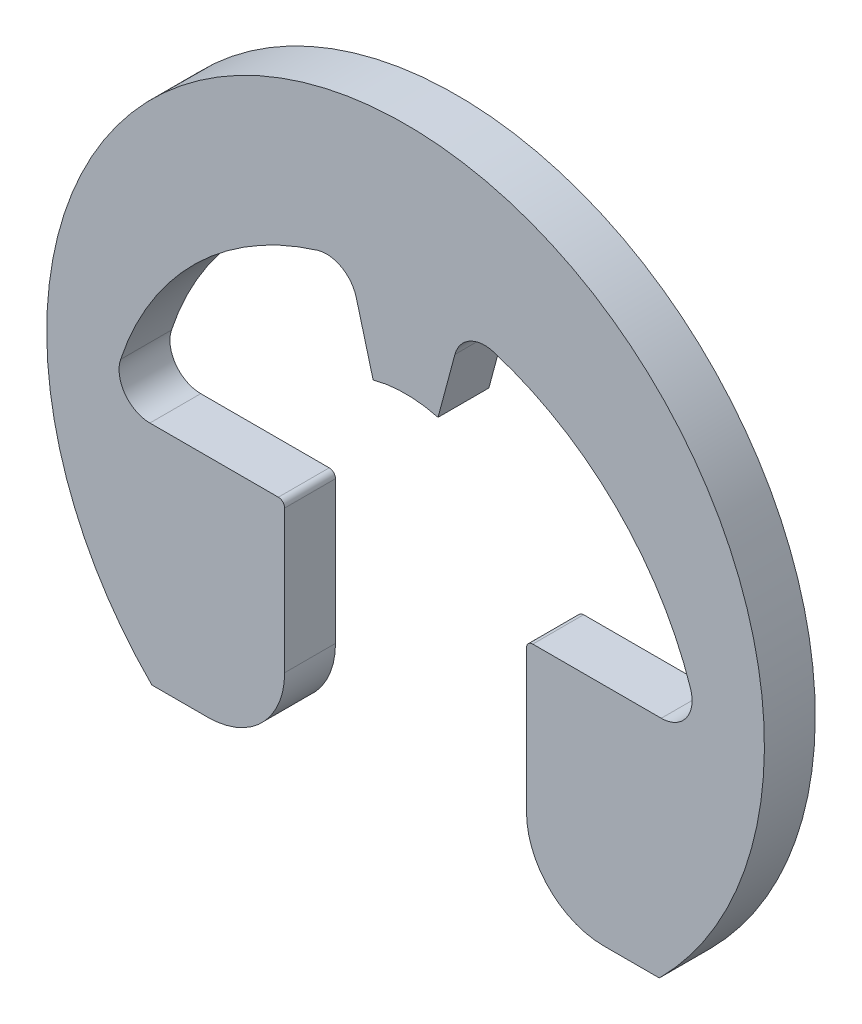
ISO-10303-21;
HEADER;
FILE_DESCRIPTION(('STEP AP214'),'2;1');
FILE_NAME('part.step','',(''),(''),'','','');
FILE_SCHEMA(('AUTOMOTIVE_DESIGN { 1 0 10303 214 1 1 1 1 }'));
ENDSEC;
DATA;
#1=APPLICATION_CONTEXT('core data for automotive mechanical design processes');
#2=APPLICATION_PROTOCOL_DEFINITION('international standard','automotive_design',2000,#1);
#3=PRODUCT_CONTEXT('',#1,'mechanical');
#4=PRODUCT('Part','Part','',(#3));
#5=PRODUCT_RELATED_PRODUCT_CATEGORY('part','',(#4));
#6=PRODUCT_DEFINITION_FORMATION('','',#4);
#7=PRODUCT_DEFINITION_CONTEXT('part definition',#1,'design');
#8=PRODUCT_DEFINITION('design','',#6,#7);
#9=PRODUCT_DEFINITION_SHAPE('','',#8);
#10=(LENGTH_UNIT() NAMED_UNIT(*) SI_UNIT(.MILLI.,.METRE.));
#11=(NAMED_UNIT(*) PLANE_ANGLE_UNIT() SI_UNIT($,.RADIAN.));
#12=(NAMED_UNIT(*) SI_UNIT($,.STERADIAN.) SOLID_ANGLE_UNIT());
#13=UNCERTAINTY_MEASURE_WITH_UNIT(LENGTH_MEASURE(1.E-05),#10,'distance_accuracy_value','');
#14=(GEOMETRIC_REPRESENTATION_CONTEXT(3) GLOBAL_UNCERTAINTY_ASSIGNED_CONTEXT((#13)) GLOBAL_UNIT_ASSIGNED_CONTEXT((#10,
#11,#12)) REPRESENTATION_CONTEXT('',''));
#15=CARTESIAN_POINT('',(0.,0.,0.));
#16=DIRECTION('',(0.,0.,1.));
#17=DIRECTION('',(1.,0.,0.));
#18=AXIS2_PLACEMENT_3D('',#15,#16,#17);
#19=CARTESIAN_POINT('',(-1.91596283078348,0.0224674878166162,-0.381));
#20=DIRECTION('',(0.,0.,1.));
#21=DIRECTION('',(1.,0.,0.));
#22=AXIS2_PLACEMENT_3D('',#19,#20,#21);
#23=CYLINDRICAL_SURFACE('',#22,0.230877533333333);
#24=CARTESIAN_POINT('',(-1.91596283078348,0.0224674878166162,0.));
#25=DIRECTION('',(0.,0.,-1.));
#26=DIRECTION('',(1.,0.,0.));
#27=AXIS2_PLACEMENT_3D('',#24,#25,#26);
#28=CIRCLE('',#27,0.230877533333333);
#29=CARTESIAN_POINT('',(-1.91596283078348,-0.208410045516717,0.));
#30=VERTEX_POINT('',#29);
#31=CARTESIAN_POINT('',(-2.13524840517973,0.0947050975486041,0.));
#32=VERTEX_POINT('',#31);
#33=EDGE_CURVE('E201',#30,#32,#28,.T.);
#34=ORIENTED_EDGE('',*,*,#33,.F.);
#35=DIRECTION('',(0.,0.,1.));
#36=VECTOR('',#35,1.);
#37=CARTESIAN_POINT('',(-1.91596283078348,-0.208410045516717,-0.381));
#38=LINE('',#37,#36);
#39=CARTESIAN_POINT('',(-1.91596283078348,-0.208410045516717,-0.381));
#40=VERTEX_POINT('',#39);
#41=EDGE_CURVE('E11',#40,#30,#38,.T.);
#42=ORIENTED_EDGE('',*,*,#41,.F.);
#43=CARTESIAN_POINT('',(-1.91596283078348,0.0224674878166162,-0.381));
#44=DIRECTION('',(0.,0.,-1.));
#45=DIRECTION('',(1.,0.,0.));
#46=AXIS2_PLACEMENT_3D('',#43,#44,#45);
#47=CIRCLE('',#46,0.230877533333333);
#48=CARTESIAN_POINT('',(-2.13524840517973,0.0947050975486041,-0.381));
#49=VERTEX_POINT('',#48);
#50=EDGE_CURVE('E257',#40,#49,#47,.T.);
#51=ORIENTED_EDGE('',*,*,#50,.T.);
#52=DIRECTION('',(0.,0.,1.));
#53=VECTOR('',#52,1.);
#54=CARTESIAN_POINT('',(-2.13524840517973,0.0947050975486041,-0.381));
#55=LINE('',#54,#53);
#56=EDGE_CURVE('E35',#49,#32,#55,.T.);
#57=ORIENTED_EDGE('',*,*,#56,.T.);
#58=EDGE_LOOP('',(#34,#42,#51,#57));
#59=FACE_BOUND('',#58,.T.);
#60=ADVANCED_FACE('F32',(#59),#23,.F.);
#61=CARTESIAN_POINT('',(-0.953165946123789,-0.208410045516717,-0.381));
#62=DIRECTION('',(0.,1.,0.));
#63=DIRECTION('',(-1.,0.,0.));
#64=AXIS2_PLACEMENT_3D('',#61,#62,#63);
#65=PLANE('',#64);
#66=DIRECTION('',(-1.,0.,0.));
#67=VECTOR('',#66,1.);
#68=CARTESIAN_POINT('',(-0.953165946123789,-0.208410045516717,0.));
#69=LINE('',#68,#67);
#70=CARTESIAN_POINT('',(-0.953165946123789,-0.208410045516717,0.));
#71=VERTEX_POINT('',#70);
#72=EDGE_CURVE('E255',#71,#30,#69,.T.);
#73=ORIENTED_EDGE('',*,*,#72,.F.);
#74=DIRECTION('',(0.,0.,1.));
#75=VECTOR('',#74,1.);
#76=CARTESIAN_POINT('',(-0.953165946123789,-0.208410045516717,-0.381));
#77=LINE('',#76,#75);
#78=CARTESIAN_POINT('',(-0.953165946123789,-0.208410045516717,-0.381));
#79=VERTEX_POINT('',#78);
#80=EDGE_CURVE('E41',#79,#71,#77,.T.);
#81=ORIENTED_EDGE('',*,*,#80,.F.);
#82=DIRECTION('',(-1.,0.,0.));
#83=VECTOR('',#82,1.);
#84=CARTESIAN_POINT('',(-0.953165946123789,-0.208410045516717,-0.381));
#85=LINE('',#84,#83);
#86=EDGE_CURVE('E191',#79,#40,#85,.T.);
#87=ORIENTED_EDGE('',*,*,#86,.T.);
#88=ORIENTED_EDGE('',*,*,#41,.T.);
#89=EDGE_LOOP('',(#73,#81,#87,#88));
#90=FACE_BOUND('',#89,.T.);
#91=ADVANCED_FACE('F293',(#90),#65,.T.);
#92=CARTESIAN_POINT('',(-0.953165946123789,-0.255400045516717,-0.381));
#93=DIRECTION('',(0.,0.,1.));
#94=DIRECTION('',(1.,0.,0.));
#95=AXIS2_PLACEMENT_3D('',#92,#93,#94);
#96=CYLINDRICAL_SURFACE('',#95,0.0469900000000002);
#97=CARTESIAN_POINT('',(-0.953165946123789,-0.255400045516717,0.));
#98=DIRECTION('',(0.,0.,1.));
#99=DIRECTION('',(1.,0.,0.));
#100=AXIS2_PLACEMENT_3D('',#97,#98,#99);
#101=CIRCLE('',#100,0.0469900000000002);
#102=CARTESIAN_POINT('',(-0.906175946123789,-0.255400045516717,0.));
#103=VERTEX_POINT('',#102);
#104=EDGE_CURVE('E178',#103,#71,#101,.T.);
#105=ORIENTED_EDGE('',*,*,#104,.F.);
#106=DIRECTION('',(0.,0.,1.));
#107=VECTOR('',#106,1.);
#108=CARTESIAN_POINT('',(-0.906175946123789,-0.255400045516717,-0.381));
#109=LINE('',#108,#107);
#110=CARTESIAN_POINT('',(-0.906175946123789,-0.255400045516717,-0.381));
#111=VERTEX_POINT('',#110);
#112=EDGE_CURVE('E173',#111,#103,#109,.T.);
#113=ORIENTED_EDGE('',*,*,#112,.F.);
#114=CARTESIAN_POINT('',(-0.953165946123789,-0.255400045516717,-0.381));
#115=DIRECTION('',(0.,0.,1.));
#116=DIRECTION('',(1.,0.,0.));
#117=AXIS2_PLACEMENT_3D('',#114,#115,#116);
#118=CIRCLE('',#117,0.0469900000000002);
#119=EDGE_CURVE('E176',#111,#79,#118,.T.);
#120=ORIENTED_EDGE('',*,*,#119,.T.);
#121=ORIENTED_EDGE('',*,*,#80,.T.);
#122=EDGE_LOOP('',(#105,#113,#120,#121));
#123=FACE_BOUND('',#122,.T.);
#124=ADVANCED_FACE('F175',(#123),#96,.T.);
#125=CARTESIAN_POINT('',(-0.906175946123789,-0.255400045516717,-0.381));
#126=DIRECTION('',(1.,0.,0.));
#127=DIRECTION('',(0.,0.,-1.));
#128=AXIS2_PLACEMENT_3D('',#125,#126,#127);
#129=PLANE('',#128);
#130=DIRECTION('',(0.,1.,0.));
#131=VECTOR('',#130,1.);
#132=CARTESIAN_POINT('',(-0.906175946123789,-0.255400045516717,0.));
#133=LINE('',#132,#131);
#134=CARTESIAN_POINT('',(-0.906175946123789,-1.32412594874414,0.));
#135=VERTEX_POINT('',#134);
#136=EDGE_CURVE('E252',#135,#103,#133,.T.);
#137=ORIENTED_EDGE('',*,*,#136,.F.);
#138=DIRECTION('',(0.,0.,1.));
#139=VECTOR('',#138,1.);
#140=CARTESIAN_POINT('',(-0.906175946123789,-1.32412594874414,-0.381));
#141=LINE('',#140,#139);
#142=CARTESIAN_POINT('',(-0.906175946123789,-1.32412594874414,-0.381));
#143=VERTEX_POINT('',#142);
#144=EDGE_CURVE('E183',#143,#135,#141,.T.);
#145=ORIENTED_EDGE('',*,*,#144,.F.);
#146=DIRECTION('',(0.,1.,0.));
#147=VECTOR('',#146,1.);
#148=CARTESIAN_POINT('',(-0.906175946123789,-0.255400045516717,-0.381));
#149=LINE('',#148,#147);
#150=EDGE_CURVE('E189',#143,#111,#149,.T.);
#151=ORIENTED_EDGE('',*,*,#150,.T.);
#152=ORIENTED_EDGE('',*,*,#112,.T.);
#153=EDGE_LOOP('',(#137,#145,#151,#152));
#154=FACE_BOUND('',#153,.T.);
#155=ADVANCED_FACE('F193',(#154),#129,.T.);
#156=CARTESIAN_POINT('',(-1.48336977945712,-1.32412594874414,-0.381));
#157=DIRECTION('',(0.,0.,1.));
#158=DIRECTION('',(1.,0.,0.));
#159=AXIS2_PLACEMENT_3D('',#156,#157,#158);
#160=CYLINDRICAL_SURFACE('',#159,0.577193833333334);
#161=CARTESIAN_POINT('',(-1.48336977945712,-1.32412594874414,0.));
#162=DIRECTION('',(0.,0.,1.));
#163=DIRECTION('',(1.,0.,0.));
#164=AXIS2_PLACEMENT_3D('',#161,#162,#163);
#165=CIRCLE('',#164,0.577193833333334);
#166=CARTESIAN_POINT('',(-1.48336977945712,-1.90131978207748,0.));
#167=VERTEX_POINT('',#166);
#168=EDGE_CURVE('E249',#167,#135,#165,.T.);
#169=ORIENTED_EDGE('',*,*,#168,.F.);
#170=DIRECTION('',(0.,0.,1.));
#171=VECTOR('',#170,1.);
#172=CARTESIAN_POINT('',(-1.48336977945712,-1.90131978207748,-0.381));
#173=LINE('',#172,#171);
#174=CARTESIAN_POINT('',(-1.48336977945712,-1.90131978207748,-0.381));
#175=VERTEX_POINT('',#174);
#176=EDGE_CURVE('E261',#175,#167,#173,.T.);
#177=ORIENTED_EDGE('',*,*,#176,.F.);
#178=CARTESIAN_POINT('',(-1.48336977945712,-1.32412594874414,-0.381));
#179=DIRECTION('',(0.,0.,1.));
#180=DIRECTION('',(1.,0.,0.));
#181=AXIS2_PLACEMENT_3D('',#178,#179,#180);
#182=CIRCLE('',#181,0.577193833333334);
#183=EDGE_CURVE('E194',#175,#143,#182,.T.);
#184=ORIENTED_EDGE('',*,*,#183,.T.);
#185=ORIENTED_EDGE('',*,*,#144,.T.);
#186=EDGE_LOOP('',(#169,#177,#184,#185));
#187=FACE_BOUND('',#186,.T.);
#188=ADVANCED_FACE('F306',(#187),#160,.T.);
#189=CARTESIAN_POINT('',(-1.48336977945712,-1.90131978207748,-0.381));
#190=DIRECTION('',(0.,-1.,0.));
#191=DIRECTION('',(1.,0.,0.));
#192=AXIS2_PLACEMENT_3D('',#189,#190,#191);
#193=PLANE('',#192);
#194=DIRECTION('',(1.,0.,0.));
#195=VECTOR('',#194,1.);
#196=CARTESIAN_POINT('',(-1.48336977945712,-1.90131978207748,0.));
#197=LINE('',#196,#195);
#198=CARTESIAN_POINT('',(-1.90131978207747,-1.90131978207748,0.));
#199=VERTEX_POINT('',#198);
#200=EDGE_CURVE('E246',#199,#167,#197,.T.);
#201=ORIENTED_EDGE('',*,*,#200,.F.);
#202=DIRECTION('',(0.,0.,1.));
#203=VECTOR('',#202,1.);
#204=CARTESIAN_POINT('',(-1.90131978207747,-1.90131978207748,-0.381));
#205=LINE('',#204,#203);
#206=CARTESIAN_POINT('',(-1.90131978207747,-1.90131978207748,-0.381));
#207=VERTEX_POINT('',#206);
#208=EDGE_CURVE('E263',#207,#199,#205,.T.);
#209=ORIENTED_EDGE('',*,*,#208,.F.);
#210=DIRECTION('',(1.,0.,0.));
#211=VECTOR('',#210,1.);
#212=CARTESIAN_POINT('',(-1.48336977945712,-1.90131978207748,-0.381));
#213=LINE('',#212,#211);
#214=EDGE_CURVE('E196',#207,#175,#213,.T.);
#215=ORIENTED_EDGE('',*,*,#214,.T.);
#216=ORIENTED_EDGE('',*,*,#176,.T.);
#217=EDGE_LOOP('',(#201,#209,#215,#216));
#218=FACE_BOUND('',#217,.T.);
#219=ADVANCED_FACE('F309',(#218),#193,.T.);
#220=CARTESIAN_POINT('',(0.,0.,-0.381));
#221=DIRECTION('',(0.,0.,1.));
#222=DIRECTION('',(1.,0.,0.));
#223=AXIS2_PLACEMENT_3D('',#220,#221,#222);
#224=CYLINDRICAL_SURFACE('',#223,2.68887222222222);
#225=CARTESIAN_POINT('',(0.,0.,0.));
#226=DIRECTION('',(0.,0.,1.));
#227=DIRECTION('',(1.,0.,0.));
#228=AXIS2_PLACEMENT_3D('',#225,#226,#227);
#229=CIRCLE('',#228,2.68887222222222);
#230=CARTESIAN_POINT('',(1.90131978207747,-1.90131978207747,0.));
#231=VERTEX_POINT('',#230);
#232=EDGE_CURVE('E243',#231,#199,#229,.T.);
#233=ORIENTED_EDGE('',*,*,#232,.F.);
#234=DIRECTION('',(0.,0.,1.));
#235=VECTOR('',#234,1.);
#236=CARTESIAN_POINT('',(1.90131978207747,-1.90131978207747,-0.381));
#237=LINE('',#236,#235);
#238=CARTESIAN_POINT('',(1.90131978207747,-1.90131978207747,-0.381));
#239=VERTEX_POINT('',#238);
#240=EDGE_CURVE('E265',#239,#231,#237,.T.);
#241=ORIENTED_EDGE('',*,*,#240,.F.);
#242=CARTESIAN_POINT('',(0.,0.,-0.381));
#243=DIRECTION('',(0.,0.,1.));
#244=DIRECTION('',(1.,0.,0.));
#245=AXIS2_PLACEMENT_3D('',#242,#243,#244);
#246=CIRCLE('',#245,2.68887222222222);
#247=EDGE_CURVE('E548',#239,#207,#246,.T.);
#248=ORIENTED_EDGE('',*,*,#247,.T.);
#249=ORIENTED_EDGE('',*,*,#208,.T.);
#250=EDGE_LOOP('',(#233,#241,#248,#249));
#251=FACE_BOUND('',#250,.T.);
#252=ADVANCED_FACE('F313',(#251),#224,.T.);
#253=CARTESIAN_POINT('',(1.90131978207747,-1.90131978207747,-0.381));
#254=DIRECTION('',(0.,-1.,0.));
#255=DIRECTION('',(1.,0.,0.));
#256=AXIS2_PLACEMENT_3D('',#253,#254,#255);
#257=PLANE('',#256);
#258=DIRECTION('',(1.,0.,0.));
#259=VECTOR('',#258,1.);
#260=CARTESIAN_POINT('',(1.90131978207747,-1.90131978207747,0.));
#261=LINE('',#260,#259);
#262=CARTESIAN_POINT('',(1.48336977945712,-1.90131978207748,0.));
#263=VERTEX_POINT('',#262);
#264=EDGE_CURVE('E240',#263,#231,#261,.T.);
#265=ORIENTED_EDGE('',*,*,#264,.F.);
#266=DIRECTION('',(0.,0.,1.));
#267=VECTOR('',#266,1.);
#268=CARTESIAN_POINT('',(1.48336977945712,-1.90131978207748,-0.381));
#269=LINE('',#268,#267);
#270=CARTESIAN_POINT('',(1.48336977945712,-1.90131978207748,-0.381));
#271=VERTEX_POINT('',#270);
#272=EDGE_CURVE('E267',#271,#263,#269,.T.);
#273=ORIENTED_EDGE('',*,*,#272,.F.);
#274=DIRECTION('',(1.,0.,0.));
#275=VECTOR('',#274,1.);
#276=CARTESIAN_POINT('',(1.90131978207747,-1.90131978207747,-0.381));
#277=LINE('',#276,#275);
#278=EDGE_CURVE('E541',#271,#239,#277,.T.);
#279=ORIENTED_EDGE('',*,*,#278,.T.);
#280=ORIENTED_EDGE('',*,*,#240,.T.);
#281=EDGE_LOOP('',(#265,#273,#279,#280));
#282=FACE_BOUND('',#281,.T.);
#283=ADVANCED_FACE('F317',(#282),#257,.T.);
#284=CARTESIAN_POINT('',(1.48336977945712,-1.32412594874414,-0.381));
#285=DIRECTION('',(0.,0.,1.));
#286=DIRECTION('',(1.,0.,0.));
#287=AXIS2_PLACEMENT_3D('',#284,#285,#286);
#288=CYLINDRICAL_SURFACE('',#287,0.577193833333334);
#289=CARTESIAN_POINT('',(1.48336977945712,-1.32412594874414,0.));
#290=DIRECTION('',(0.,0.,1.));
#291=DIRECTION('',(1.,0.,0.));
#292=AXIS2_PLACEMENT_3D('',#289,#290,#291);
#293=CIRCLE('',#292,0.577193833333334);
#294=CARTESIAN_POINT('',(0.906175946123789,-1.32412594874414,0.));
#295=VERTEX_POINT('',#294);
#296=EDGE_CURVE('E237',#295,#263,#293,.T.);
#297=ORIENTED_EDGE('',*,*,#296,.F.);
#298=DIRECTION('',(0.,0.,1.));
#299=VECTOR('',#298,1.);
#300=CARTESIAN_POINT('',(0.906175946123789,-1.32412594874414,-0.381));
#301=LINE('',#300,#299);
#302=CARTESIAN_POINT('',(0.906175946123789,-1.32412594874414,-0.381));
#303=VERTEX_POINT('',#302);
#304=EDGE_CURVE('E269',#303,#295,#301,.T.);
#305=ORIENTED_EDGE('',*,*,#304,.F.);
#306=CARTESIAN_POINT('',(1.48336977945712,-1.32412594874414,-0.381));
#307=DIRECTION('',(0.,0.,1.));
#308=DIRECTION('',(1.,0.,0.));
#309=AXIS2_PLACEMENT_3D('',#306,#307,#308);
#310=CIRCLE('',#309,0.577193833333334);
#311=EDGE_CURVE('E537',#303,#271,#310,.T.);
#312=ORIENTED_EDGE('',*,*,#311,.T.);
#313=ORIENTED_EDGE('',*,*,#272,.T.);
#314=EDGE_LOOP('',(#297,#305,#312,#313));
#315=FACE_BOUND('',#314,.T.);
#316=ADVANCED_FACE('F321',(#315),#288,.T.);
#317=CARTESIAN_POINT('',(0.906175946123789,-0.255400045516717,-0.381));
#318=DIRECTION('',(-1.,0.,0.));
#319=DIRECTION('',(0.,0.,1.));
#320=AXIS2_PLACEMENT_3D('',#317,#318,#319);
#321=PLANE('',#320);
#322=DIRECTION('',(0.,-1.,0.));
#323=VECTOR('',#322,1.);
#324=CARTESIAN_POINT('',(0.906175946123789,-0.255400045516717,0.));
#325=LINE('',#324,#323);
#326=CARTESIAN_POINT('',(0.906175946123789,-0.255400045516717,0.));
#327=VERTEX_POINT('',#326);
#328=EDGE_CURVE('E234',#327,#295,#325,.T.);
#329=ORIENTED_EDGE('',*,*,#328,.F.);
#330=DIRECTION('',(0.,0.,1.));
#331=VECTOR('',#330,1.);
#332=CARTESIAN_POINT('',(0.906175946123789,-0.255400045516717,-0.381));
#333=LINE('',#332,#331);
#334=CARTESIAN_POINT('',(0.906175946123789,-0.255400045516717,-0.381));
#335=VERTEX_POINT('',#334);
#336=EDGE_CURVE('E271',#335,#327,#333,.T.);
#337=ORIENTED_EDGE('',*,*,#336,.F.);
#338=DIRECTION('',(0.,-1.,0.));
#339=VECTOR('',#338,1.);
#340=CARTESIAN_POINT('',(0.906175946123789,-0.255400045516717,-0.381));
#341=LINE('',#340,#339);
#342=EDGE_CURVE('E553',#335,#303,#341,.T.);
#343=ORIENTED_EDGE('',*,*,#342,.T.);
#344=ORIENTED_EDGE('',*,*,#304,.T.);
#345=EDGE_LOOP('',(#329,#337,#343,#344));
#346=FACE_BOUND('',#345,.T.);
#347=ADVANCED_FACE('F325',(#346),#321,.T.);
#348=CARTESIAN_POINT('',(0.953165946123789,-0.255400045516717,-0.381));
#349=DIRECTION('',(0.,0.,1.));
#350=DIRECTION('',(1.,0.,0.));
#351=AXIS2_PLACEMENT_3D('',#348,#349,#350);
#352=CYLINDRICAL_SURFACE('',#351,0.0469900000000001);
#353=CARTESIAN_POINT('',(0.953165946123789,-0.255400045516717,0.));
#354=DIRECTION('',(0.,0.,1.));
#355=DIRECTION('',(1.,0.,0.));
#356=AXIS2_PLACEMENT_3D('',#353,#354,#355);
#357=CIRCLE('',#356,0.0469900000000001);
#358=CARTESIAN_POINT('',(0.953165946123789,-0.208410045516717,0.));
#359=VERTEX_POINT('',#358);
#360=EDGE_CURVE('E231',#359,#327,#357,.T.);
#361=ORIENTED_EDGE('',*,*,#360,.F.);
#362=DIRECTION('',(0.,0.,1.));
#363=VECTOR('',#362,1.);
#364=CARTESIAN_POINT('',(0.953165946123789,-0.208410045516717,-0.381));
#365=LINE('',#364,#363);
#366=CARTESIAN_POINT('',(0.953165946123789,-0.208410045516717,-0.381));
#367=VERTEX_POINT('',#366);
#368=EDGE_CURVE('E273',#367,#359,#365,.T.);
#369=ORIENTED_EDGE('',*,*,#368,.F.);
#370=CARTESIAN_POINT('',(0.953165946123789,-0.255400045516717,-0.381));
#371=DIRECTION('',(0.,0.,1.));
#372=DIRECTION('',(1.,0.,0.));
#373=AXIS2_PLACEMENT_3D('',#370,#371,#372);
#374=CIRCLE('',#373,0.0469900000000001);
#375=EDGE_CURVE('E530',#367,#335,#374,.T.);
#376=ORIENTED_EDGE('',*,*,#375,.T.);
#377=ORIENTED_EDGE('',*,*,#336,.T.);
#378=EDGE_LOOP('',(#361,#369,#376,#377));
#379=FACE_BOUND('',#378,.T.);
#380=ADVANCED_FACE('F329',(#379),#352,.T.);
#381=CARTESIAN_POINT('',(0.953165946123789,-0.208410045516717,-0.381));
#382=DIRECTION('',(0.,1.,0.));
#383=DIRECTION('',(0.,0.,1.));
#384=AXIS2_PLACEMENT_3D('',#381,#382,#383);
#385=PLANE('',#384);
#386=DIRECTION('',(-1.,0.,0.));
#387=VECTOR('',#386,1.);
#388=CARTESIAN_POINT('',(0.953165946123789,-0.208410045516717,0.));
#389=LINE('',#388,#387);
#390=CARTESIAN_POINT('',(1.91596283078348,-0.208410045516717,0.));
#391=VERTEX_POINT('',#390);
#392=EDGE_CURVE('E228',#391,#359,#389,.T.);
#393=ORIENTED_EDGE('',*,*,#392,.F.);
#394=DIRECTION('',(0.,0.,1.));
#395=VECTOR('',#394,1.);
#396=CARTESIAN_POINT('',(1.91596283078348,-0.208410045516717,-0.381));
#397=LINE('',#396,#395);
#398=CARTESIAN_POINT('',(1.91596283078348,-0.208410045516717,-0.381));
#399=VERTEX_POINT('',#398);
#400=EDGE_CURVE('E275',#399,#391,#397,.T.);
#401=ORIENTED_EDGE('',*,*,#400,.F.);
#402=DIRECTION('',(-1.,0.,0.));
#403=VECTOR('',#402,1.);
#404=CARTESIAN_POINT('',(0.953165946123789,-0.208410045516717,-0.381));
#405=LINE('',#404,#403);
#406=EDGE_CURVE('E526',#399,#367,#405,.T.);
#407=ORIENTED_EDGE('',*,*,#406,.T.);
#408=ORIENTED_EDGE('',*,*,#368,.T.);
#409=EDGE_LOOP('',(#393,#401,#407,#408));
#410=FACE_BOUND('',#409,.T.);
#411=ADVANCED_FACE('F333',(#410),#385,.T.);
#412=CARTESIAN_POINT('',(1.91596283078348,0.0224674878166161,-0.381));
#413=DIRECTION('',(0.,0.,1.));
#414=DIRECTION('',(1.,0.,0.));
#415=AXIS2_PLACEMENT_3D('',#412,#413,#414);
#416=CYLINDRICAL_SURFACE('',#415,0.230877533333333);
#417=CARTESIAN_POINT('',(1.91596283078348,0.0224674878166161,0.));
#418=DIRECTION('',(0.,0.,-1.));
#419=DIRECTION('',(1.,0.,0.));
#420=AXIS2_PLACEMENT_3D('',#417,#418,#419);
#421=CIRCLE('',#420,0.230877533333333);
#422=CARTESIAN_POINT('',(2.13524840517973,0.0947050975486035,0.));
#423=VERTEX_POINT('',#422);
#424=EDGE_CURVE('E225',#423,#391,#421,.T.);
#425=ORIENTED_EDGE('',*,*,#424,.F.);
#426=DIRECTION('',(0.,0.,1.));
#427=VECTOR('',#426,1.);
#428=CARTESIAN_POINT('',(2.13524840517973,0.0947050975486035,-0.381));
#429=LINE('',#428,#427);
#430=CARTESIAN_POINT('',(2.13524840517973,0.0947050975486035,-0.381));
#431=VERTEX_POINT('',#430);
#432=EDGE_CURVE('E277',#431,#423,#429,.T.);
#433=ORIENTED_EDGE('',*,*,#432,.F.);
#434=CARTESIAN_POINT('',(1.91596283078348,0.0224674878166161,-0.381));
#435=DIRECTION('',(0.,0.,-1.));
#436=DIRECTION('',(1.,0.,0.));
#437=AXIS2_PLACEMENT_3D('',#434,#435,#436);
#438=CIRCLE('',#437,0.230877533333333);
#439=EDGE_CURVE('E557',#431,#399,#438,.T.);
#440=ORIENTED_EDGE('',*,*,#439,.T.);
#441=ORIENTED_EDGE('',*,*,#400,.T.);
#442=EDGE_LOOP('',(#425,#433,#440,#441));
#443=FACE_BOUND('',#442,.T.);
#444=ADVANCED_FACE('F337',(#443),#416,.F.);
#445=CARTESIAN_POINT('',(0.,-0.608693844214438,-0.381));
#446=DIRECTION('',(0.,0.,1.));
#447=DIRECTION('',(1.,0.,0.));
#448=AXIS2_PLACEMENT_3D('',#445,#446,#447);
#449=CYLINDRICAL_SURFACE('',#448,2.24812273310333);
#450=CARTESIAN_POINT('',(0.,-0.608693844214438,0.));
#451=DIRECTION('',(0.,0.,-1.));
#452=DIRECTION('',(-1.,0.,0.));
#453=AXIS2_PLACEMENT_3D('',#450,#451,#452);
#454=CIRCLE('',#453,2.24812273310333);
#455=CARTESIAN_POINT('',(0.660416898653682,1.54023736526357,0.));
#456=VERTEX_POINT('',#455);
#457=EDGE_CURVE('E222',#456,#423,#454,.T.);
#458=ORIENTED_EDGE('',*,*,#457,.F.);
#459=DIRECTION('',(0.,0.,1.));
#460=VECTOR('',#459,1.);
#461=CARTESIAN_POINT('',(0.660416898653682,1.54023736526357,-0.381));
#462=LINE('',#461,#460);
#463=CARTESIAN_POINT('',(0.660416898653682,1.54023736526357,-0.381));
#464=VERTEX_POINT('',#463);
#465=EDGE_CURVE('E279',#464,#456,#462,.T.);
#466=ORIENTED_EDGE('',*,*,#465,.F.);
#467=CARTESIAN_POINT('',(0.,-0.608693844214438,-0.381));
#468=DIRECTION('',(0.,0.,-1.));
#469=DIRECTION('',(-1.,0.,0.));
#470=AXIS2_PLACEMENT_3D('',#467,#468,#469);
#471=CIRCLE('',#470,2.24812273310333);
#472=EDGE_CURVE('E519',#464,#431,#471,.T.);
#473=ORIENTED_EDGE('',*,*,#472,.T.);
#474=ORIENTED_EDGE('',*,*,#432,.T.);
#475=EDGE_LOOP('',(#458,#466,#473,#474));
#476=FACE_BOUND('',#475,.T.);
#477=ADVANCED_FACE('F341',(#476),#449,.F.);
#478=CARTESIAN_POINT('',(0.592593455436979,1.31954659529728,-0.381));
#479=DIRECTION('',(0.,0.,1.));
#480=DIRECTION('',(1.,0.,0.));
#481=AXIS2_PLACEMENT_3D('',#478,#479,#480);
#482=CYLINDRICAL_SURFACE('',#481,0.230877533333333);
#483=CARTESIAN_POINT('',(0.592593455436979,1.31954659529728,0.));
#484=DIRECTION('',(0.,0.,-1.));
#485=DIRECTION('',(1.,0.,0.));
#486=AXIS2_PLACEMENT_3D('',#483,#484,#485);
#487=CIRCLE('',#486,0.230877533333333);
#488=CARTESIAN_POINT('',(0.369582883280397,1.37930209801024,0.));
#489=VERTEX_POINT('',#488);
#490=EDGE_CURVE('E219',#489,#456,#487,.T.);
#491=ORIENTED_EDGE('',*,*,#490,.F.);
#492=DIRECTION('',(0.,0.,1.));
#493=VECTOR('',#492,1.);
#494=CARTESIAN_POINT('',(0.369582883280397,1.37930209801024,-0.381));
#495=LINE('',#494,#493);
#496=CARTESIAN_POINT('',(0.369582883280397,1.37930209801024,-0.381));
#497=VERTEX_POINT('',#496);
#498=EDGE_CURVE('E281',#497,#489,#495,.T.);
#499=ORIENTED_EDGE('',*,*,#498,.F.);
#500=CARTESIAN_POINT('',(0.592593455436979,1.31954659529728,-0.381));
#501=DIRECTION('',(0.,0.,-1.));
#502=DIRECTION('',(1.,0.,0.));
#503=AXIS2_PLACEMENT_3D('',#500,#501,#502);
#504=CIRCLE('',#503,0.230877533333333);
#505=EDGE_CURVE('E515',#497,#464,#504,.T.);
#506=ORIENTED_EDGE('',*,*,#505,.T.);
#507=ORIENTED_EDGE('',*,*,#465,.T.);
#508=EDGE_LOOP('',(#491,#499,#506,#507));
#509=FACE_BOUND('',#508,.T.);
#510=ADVANCED_FACE('F345',(#509),#482,.F.);
#511=CARTESIAN_POINT('',(0.369582883280397,1.37930209801024,-0.381));
#512=DIRECTION('',(0.965925826289068,-0.258819045102522,0.));
#513=DIRECTION('',(0.258819045102522,0.965925826289068,0.));
#514=AXIS2_PLACEMENT_3D('',#511,#512,#513);
#515=PLANE('',#514);
#516=DIRECTION('',(0.258819045102522,0.965925826289068,0.));
#517=VECTOR('',#516,1.);
#518=CARTESIAN_POINT('',(0.369582883280397,1.37930209801024,0.));
#519=LINE('',#518,#517);
#520=CARTESIAN_POINT('',(0.243238138587349,0.907777091546467,0.));
#521=VERTEX_POINT('',#520);
#522=EDGE_CURVE('E216',#521,#489,#519,.T.);
#523=ORIENTED_EDGE('',*,*,#522,.F.);
#524=DIRECTION('',(0.,0.,1.));
#525=VECTOR('',#524,1.);
#526=CARTESIAN_POINT('',(0.243238138587349,0.907777091546467,-0.381));
#527=LINE('',#526,#525);
#528=CARTESIAN_POINT('',(0.243238138587349,0.907777091546467,-0.381));
#529=VERTEX_POINT('',#528);
#530=EDGE_CURVE('E283',#529,#521,#527,.T.);
#531=ORIENTED_EDGE('',*,*,#530,.F.);
#532=DIRECTION('',(0.258819045102522,0.965925826289068,0.));
#533=VECTOR('',#532,1.);
#534=CARTESIAN_POINT('',(0.369582883280397,1.37930209801024,-0.381));
#535=LINE('',#534,#533);
#536=EDGE_CURVE('E561',#529,#497,#535,.T.);
#537=ORIENTED_EDGE('',*,*,#536,.T.);
#538=ORIENTED_EDGE('',*,*,#498,.T.);
#539=EDGE_LOOP('',(#523,#531,#537,#538));
#540=FACE_BOUND('',#539,.T.);
#541=ADVANCED_FACE('F349',(#540),#515,.T.);
#542=CARTESIAN_POINT('',(0.,0.,-0.381));
#543=DIRECTION('',(0.,0.,1.));
#544=DIRECTION('',(1.,0.,0.));
#545=AXIS2_PLACEMENT_3D('',#542,#543,#544);
#546=CYLINDRICAL_SURFACE('',#545,0.9398);
#547=CARTESIAN_POINT('',(0.,0.,0.));
#548=DIRECTION('',(0.,0.,-1.));
#549=DIRECTION('',(-1.,0.,0.));
#550=AXIS2_PLACEMENT_3D('',#547,#548,#549);
#551=CIRCLE('',#550,0.9398);
#552=CARTESIAN_POINT('',(-0.243238138587349,0.907777091546467,0.));
#553=VERTEX_POINT('',#552);
#554=EDGE_CURVE('E213',#553,#521,#551,.T.);
#555=ORIENTED_EDGE('',*,*,#554,.F.);
#556=DIRECTION('',(0.,0.,1.));
#557=VECTOR('',#556,1.);
#558=CARTESIAN_POINT('',(-0.243238138587349,0.907777091546467,-0.381));
#559=LINE('',#558,#557);
#560=CARTESIAN_POINT('',(-0.243238138587349,0.907777091546467,-0.381));
#561=VERTEX_POINT('',#560);
#562=EDGE_CURVE('E285',#561,#553,#559,.T.);
#563=ORIENTED_EDGE('',*,*,#562,.F.);
#564=CARTESIAN_POINT('',(0.,0.,-0.381));
#565=DIRECTION('',(0.,0.,-1.));
#566=DIRECTION('',(-1.,0.,0.));
#567=AXIS2_PLACEMENT_3D('',#564,#565,#566);
#568=CIRCLE('',#567,0.9398);
#569=EDGE_CURVE('E508',#561,#529,#568,.T.);
#570=ORIENTED_EDGE('',*,*,#569,.T.);
#571=ORIENTED_EDGE('',*,*,#530,.T.);
#572=EDGE_LOOP('',(#555,#563,#570,#571));
#573=FACE_BOUND('',#572,.T.);
#574=ADVANCED_FACE('F353',(#573),#546,.F.);
#575=CARTESIAN_POINT('',(-0.369582883280397,1.37930209801024,-0.381));
#576=DIRECTION('',(-0.965925826289068,-0.258819045102522,0.));
#577=DIRECTION('',(0.258819045102522,-0.965925826289068,0.));
#578=AXIS2_PLACEMENT_3D('',#575,#576,#577);
#579=PLANE('',#578);
#580=DIRECTION('',(0.258819045102522,-0.965925826289068,0.));
#581=VECTOR('',#580,1.);
#582=CARTESIAN_POINT('',(-0.369582883280397,1.37930209801024,0.));
#583=LINE('',#582,#581);
#584=CARTESIAN_POINT('',(-0.369582883280397,1.37930209801024,0.));
#585=VERTEX_POINT('',#584);
#586=EDGE_CURVE('E210',#585,#553,#583,.T.);
#587=ORIENTED_EDGE('',*,*,#586,.F.);
#588=DIRECTION('',(0.,0.,1.));
#589=VECTOR('',#588,1.);
#590=CARTESIAN_POINT('',(-0.369582883280397,1.37930209801024,-0.381));
#591=LINE('',#590,#589);
#592=CARTESIAN_POINT('',(-0.369582883280397,1.37930209801024,-0.381));
#593=VERTEX_POINT('',#592);
#594=EDGE_CURVE('E287',#593,#585,#591,.T.);
#595=ORIENTED_EDGE('',*,*,#594,.F.);
#596=DIRECTION('',(0.258819045102522,-0.965925826289068,0.));
#597=VECTOR('',#596,1.);
#598=CARTESIAN_POINT('',(-0.369582883280397,1.37930209801024,-0.381));
#599=LINE('',#598,#597);
#600=EDGE_CURVE('E504',#593,#561,#599,.T.);
#601=ORIENTED_EDGE('',*,*,#600,.T.);
#602=ORIENTED_EDGE('',*,*,#562,.T.);
#603=EDGE_LOOP('',(#587,#595,#601,#602));
#604=FACE_BOUND('',#603,.T.);
#605=ADVANCED_FACE('F357',(#604),#579,.T.);
#606=CARTESIAN_POINT('',(-0.592593455436979,1.31954659529728,-0.381));
#607=DIRECTION('',(0.,0.,1.));
#608=DIRECTION('',(1.,0.,0.));
#609=AXIS2_PLACEMENT_3D('',#606,#607,#608);
#610=CYLINDRICAL_SURFACE('',#609,0.230877533333333);
#611=CARTESIAN_POINT('',(-0.592593455436979,1.31954659529728,0.));
#612=DIRECTION('',(0.,0.,-1.));
#613=DIRECTION('',(1.,0.,0.));
#614=AXIS2_PLACEMENT_3D('',#611,#612,#613);
#615=CIRCLE('',#614,0.230877533333333);
#616=CARTESIAN_POINT('',(-0.660416898653682,1.54023736526357,0.));
#617=VERTEX_POINT('',#616);
#618=EDGE_CURVE('E207',#617,#585,#615,.T.);
#619=ORIENTED_EDGE('',*,*,#618,.F.);
#620=DIRECTION('',(0.,0.,1.));
#621=VECTOR('',#620,1.);
#622=CARTESIAN_POINT('',(-0.660416898653682,1.54023736526357,-0.381));
#623=LINE('',#622,#621);
#624=CARTESIAN_POINT('',(-0.660416898653682,1.54023736526357,-0.381));
#625=VERTEX_POINT('',#624);
#626=EDGE_CURVE('E288',#625,#617,#623,.T.);
#627=ORIENTED_EDGE('',*,*,#626,.F.);
#628=CARTESIAN_POINT('',(-0.592593455436979,1.31954659529728,-0.381));
#629=DIRECTION('',(0.,0.,-1.));
#630=DIRECTION('',(1.,0.,0.));
#631=AXIS2_PLACEMENT_3D('',#628,#629,#630);
#632=CIRCLE('',#631,0.230877533333333);
#633=EDGE_CURVE('E565',#625,#593,#632,.T.);
#634=ORIENTED_EDGE('',*,*,#633,.T.);
#635=ORIENTED_EDGE('',*,*,#594,.T.);
#636=EDGE_LOOP('',(#619,#627,#634,#635));
#637=FACE_BOUND('',#636,.T.);
#638=ADVANCED_FACE('F361',(#637),#610,.F.);
#639=CARTESIAN_POINT('',(0.,-0.608693844214438,-0.381));
#640=DIRECTION('',(0.,0.,1.));
#641=DIRECTION('',(1.,0.,0.));
#642=AXIS2_PLACEMENT_3D('',#639,#640,#641);
#643=CYLINDRICAL_SURFACE('',#642,2.24812273310333);
#644=CARTESIAN_POINT('',(0.,-0.608693844214438,0.));
#645=DIRECTION('',(0.,0.,-1.));
#646=DIRECTION('',(-1.,0.,0.));
#647=AXIS2_PLACEMENT_3D('',#644,#645,#646);
#648=CIRCLE('',#647,2.24812273310333);
#649=EDGE_CURVE('E204',#32,#617,#648,.T.);
#650=ORIENTED_EDGE('',*,*,#649,.F.);
#651=ORIENTED_EDGE('',*,*,#56,.F.);
#652=CARTESIAN_POINT('',(0.,-0.608693844214438,-0.381));
#653=DIRECTION('',(0.,0.,-1.));
#654=DIRECTION('',(-1.,0.,0.));
#655=AXIS2_PLACEMENT_3D('',#652,#653,#654);
#656=CIRCLE('',#655,2.24812273310333);
#657=EDGE_CURVE('E567',#49,#625,#656,.T.);
#658=ORIENTED_EDGE('',*,*,#657,.T.);
#659=ORIENTED_EDGE('',*,*,#626,.T.);
#660=EDGE_LOOP('',(#650,#651,#658,#659));
#661=FACE_BOUND('',#660,.T.);
#662=ADVANCED_FACE('F290',(#661),#643,.F.);
#663=CARTESIAN_POINT('',(-1.91596283078348,0.0224674878166162,-0.381));
#664=DIRECTION('',(0.,0.,1.));
#665=DIRECTION('',(1.,0.,0.));
#666=AXIS2_PLACEMENT_3D('',#663,#664,#665);
#667=PLANE('',#666);
#668=ORIENTED_EDGE('',*,*,#50,.F.);
#669=ORIENTED_EDGE('',*,*,#86,.F.);
#670=ORIENTED_EDGE('',*,*,#119,.F.);
#671=ORIENTED_EDGE('',*,*,#150,.F.);
#672=ORIENTED_EDGE('',*,*,#183,.F.);
#673=ORIENTED_EDGE('',*,*,#214,.F.);
#674=ORIENTED_EDGE('',*,*,#247,.F.);
#675=ORIENTED_EDGE('',*,*,#278,.F.);
#676=ORIENTED_EDGE('',*,*,#311,.F.);
#677=ORIENTED_EDGE('',*,*,#342,.F.);
#678=ORIENTED_EDGE('',*,*,#375,.F.);
#679=ORIENTED_EDGE('',*,*,#406,.F.);
#680=ORIENTED_EDGE('',*,*,#439,.F.);
#681=ORIENTED_EDGE('',*,*,#472,.F.);
#682=ORIENTED_EDGE('',*,*,#505,.F.);
#683=ORIENTED_EDGE('',*,*,#536,.F.);
#684=ORIENTED_EDGE('',*,*,#569,.F.);
#685=ORIENTED_EDGE('',*,*,#600,.F.);
#686=ORIENTED_EDGE('',*,*,#633,.F.);
#687=ORIENTED_EDGE('',*,*,#657,.F.);
#688=EDGE_LOOP('',(#668,#669,#670,#671,#672,#673,#674,#675,#676,#677,#678,#679,#680,#681,#682,
#683,#684,#685,#686,#687));
#689=FACE_BOUND('',#688,.T.);
#690=ADVANCED_FACE('F187',(#689),#667,.F.);
#691=CARTESIAN_POINT('',(-1.91596283078348,0.0224674878166162,0.));
#692=DIRECTION('',(0.,0.,1.));
#693=DIRECTION('',(1.,0.,0.));
#694=AXIS2_PLACEMENT_3D('',#691,#692,#693);
#695=PLANE('',#694);
#696=ORIENTED_EDGE('',*,*,#33,.T.);
#697=ORIENTED_EDGE('',*,*,#649,.T.);
#698=ORIENTED_EDGE('',*,*,#618,.T.);
#699=ORIENTED_EDGE('',*,*,#586,.T.);
#700=ORIENTED_EDGE('',*,*,#554,.T.);
#701=ORIENTED_EDGE('',*,*,#522,.T.);
#702=ORIENTED_EDGE('',*,*,#490,.T.);
#703=ORIENTED_EDGE('',*,*,#457,.T.);
#704=ORIENTED_EDGE('',*,*,#424,.T.);
#705=ORIENTED_EDGE('',*,*,#392,.T.);
#706=ORIENTED_EDGE('',*,*,#360,.T.);
#707=ORIENTED_EDGE('',*,*,#328,.T.);
#708=ORIENTED_EDGE('',*,*,#296,.T.);
#709=ORIENTED_EDGE('',*,*,#264,.T.);
#710=ORIENTED_EDGE('',*,*,#232,.T.);
#711=ORIENTED_EDGE('',*,*,#200,.T.);
#712=ORIENTED_EDGE('',*,*,#168,.T.);
#713=ORIENTED_EDGE('',*,*,#136,.T.);
#714=ORIENTED_EDGE('',*,*,#104,.T.);
#715=ORIENTED_EDGE('',*,*,#72,.T.);
#716=EDGE_LOOP('',(#696,#697,#698,#699,#700,#701,#702,#703,#704,#705,#706,#707,#708,#709,#710,
#711,#712,#713,#714,#715));
#717=FACE_BOUND('',#716,.T.);
#718=ADVANCED_FACE('F292',(#717),#695,.T.);
#719=CLOSED_SHELL('',(#60,#91,#124,#155,#188,#219,#252,#283,#316,#347,#380,#411,#444,#477,#510,
#541,#574,#605,#638,#662,#690,#718));
#720=MANIFOLD_SOLID_BREP('B2',#719);
#721=ADVANCED_BREP_SHAPE_REPRESENTATION('',(#18,#720),#14);
#722=SHAPE_DEFINITION_REPRESENTATION(#9,#721);
ENDSEC;
END-ISO-10303-21;
